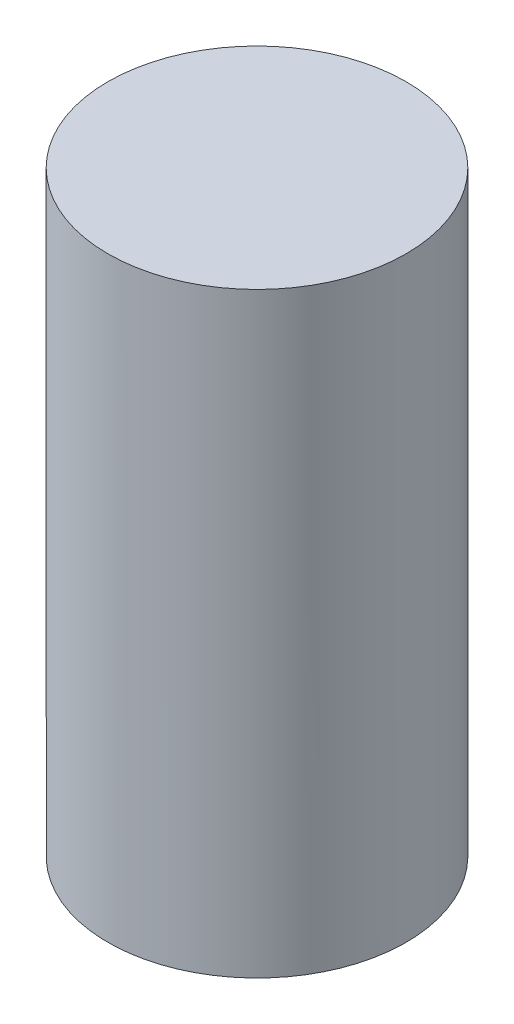
ISO-10303-21;
HEADER;
FILE_DESCRIPTION(('STEP AP214'),'2;1');
FILE_NAME('part.step','',(''),(''),'','','');
FILE_SCHEMA(('AUTOMOTIVE_DESIGN { 1 0 10303 214 1 1 1 1 }'));
ENDSEC;
DATA;
#1=APPLICATION_CONTEXT('core data for automotive mechanical design processes');
#2=APPLICATION_PROTOCOL_DEFINITION('international standard','automotive_design',2000,#1);
#3=PRODUCT_CONTEXT('',#1,'mechanical');
#4=PRODUCT('Part','Part','',(#3));
#5=PRODUCT_RELATED_PRODUCT_CATEGORY('part','',(#4));
#6=PRODUCT_DEFINITION_FORMATION('','',#4);
#7=PRODUCT_DEFINITION_CONTEXT('part definition',#1,'design');
#8=PRODUCT_DEFINITION('design','',#6,#7);
#9=PRODUCT_DEFINITION_SHAPE('','',#8);
#10=(LENGTH_UNIT() NAMED_UNIT(*) SI_UNIT(.MILLI.,.METRE.));
#11=(NAMED_UNIT(*) PLANE_ANGLE_UNIT() SI_UNIT($,.RADIAN.));
#12=(NAMED_UNIT(*) SI_UNIT($,.STERADIAN.) SOLID_ANGLE_UNIT());
#13=UNCERTAINTY_MEASURE_WITH_UNIT(LENGTH_MEASURE(1.E-05),#10,'distance_accuracy_value','');
#14=(GEOMETRIC_REPRESENTATION_CONTEXT(3) GLOBAL_UNCERTAINTY_ASSIGNED_CONTEXT((#13)) GLOBAL_UNIT_ASSIGNED_CONTEXT((#10,
#11,#12)) REPRESENTATION_CONTEXT('',''));
#15=CARTESIAN_POINT('',(0.,0.,0.));
#16=DIRECTION('',(0.,0.,1.));
#17=DIRECTION('',(1.,0.,0.));
#18=AXIS2_PLACEMENT_3D('',#15,#16,#17);
#19=CARTESIAN_POINT('',(0.,15.,0.));
#20=DIRECTION('',(0.,-1.,0.));
#21=DIRECTION('',(0.,0.,-1.));
#22=AXIS2_PLACEMENT_3D('',#19,#20,#21);
#23=CYLINDRICAL_SURFACE('',#22,5.);
#24=CARTESIAN_POINT('',(0.,-2.,0.));
#25=DIRECTION('',(0.,-1.,0.));
#26=DIRECTION('',(0.,0.,-1.));
#27=AXIS2_PLACEMENT_3D('',#24,#25,#26);
#28=CIRCLE('',#27,5.);
#29=CARTESIAN_POINT('',(0.,-2.,-5.));
#30=VERTEX_POINT('',#29);
#31=EDGE_CURVE('E161',#30,#30,#28,.T.);
#32=ORIENTED_EDGE('',*,*,#31,.F.);
#33=EDGE_LOOP('',(#32));
#34=FACE_BOUND('',#33,.T.);
#35=CARTESIAN_POINT('',(0.,18.,0.));
#36=DIRECTION('',(0.,1.,0.));
#37=DIRECTION('',(0.,0.,1.));
#38=AXIS2_PLACEMENT_3D('',#35,#36,#37);
#39=CIRCLE('',#38,5.);
#40=CARTESIAN_POINT('',(0.,18.,5.));
#41=VERTEX_POINT('',#40);
#42=EDGE_CURVE('E264',#41,#41,#39,.T.);
#43=ORIENTED_EDGE('',*,*,#42,.F.);
#44=EDGE_LOOP('',(#43));
#45=FACE_BOUND('',#44,.T.);
#46=ADVANCED_FACE('F42',(#34,#45),#23,.T.);
#47=CARTESIAN_POINT('',(1.29903810567666,15.,-0.750000000000004));
#48=DIRECTION('',(1.,0.,0.));
#49=DIRECTION('',(0.,0.,-1.));
#50=AXIS2_PLACEMENT_3D('',#47,#48,#49);
#51=PLANE('',#50);
#52=DIRECTION('',(0.,0.,1.));
#53=VECTOR('',#52,1.);
#54=CARTESIAN_POINT('',(1.29903810567666,0.,-0.750000000000004));
#55=LINE('',#54,#53);
#56=CARTESIAN_POINT('',(1.29903810567664,0.,-3.25000000000001));
#57=VERTEX_POINT('',#56);
#58=CARTESIAN_POINT('',(1.29903810567666,0.,-0.750000000000004));
#59=VERTEX_POINT('',#58);
#60=EDGE_CURVE('E184',#57,#59,#55,.T.);
#61=ORIENTED_EDGE('',*,*,#60,.F.);
#62=DIRECTION('',(0.,-1.,0.));
#63=VECTOR('',#62,1.);
#64=CARTESIAN_POINT('',(1.29903810567664,15.,-3.25000000000001));
#65=LINE('',#64,#63);
#66=CARTESIAN_POINT('',(1.29903810567664,15.,-3.25000000000001));
#67=VERTEX_POINT('',#66);
#68=EDGE_CURVE('E121',#67,#57,#65,.T.);
#69=ORIENTED_EDGE('',*,*,#68,.F.);
#70=DIRECTION('',(0.,0.,1.));
#71=VECTOR('',#70,1.);
#72=CARTESIAN_POINT('',(1.29903810567666,15.,-0.750000000000004));
#73=LINE('',#72,#71);
#74=CARTESIAN_POINT('',(1.29903810567666,15.,-0.750000000000004));
#75=VERTEX_POINT('',#74);
#76=EDGE_CURVE('E57',#67,#75,#73,.T.);
#77=ORIENTED_EDGE('',*,*,#76,.T.);
#78=DIRECTION('',(0.,-1.,0.));
#79=VECTOR('',#78,1.);
#80=CARTESIAN_POINT('',(1.29903810567666,15.,-0.750000000000004));
#81=LINE('',#80,#79);
#82=EDGE_CURVE('E11',#75,#59,#81,.T.);
#83=ORIENTED_EDGE('',*,*,#82,.T.);
#84=EDGE_LOOP('',(#61,#69,#77,#83));
#85=FACE_BOUND('',#84,.T.);
#86=ADVANCED_FACE('F203',(#85),#51,.T.);
#87=CARTESIAN_POINT('',(1.29903810567666,15.,-0.750000000000004));
#88=DIRECTION('',(0.5,0.,-0.866025403784439));
#89=DIRECTION('',(-0.866025403784439,0.,-0.5));
#90=AXIS2_PLACEMENT_3D('',#87,#88,#89);
#91=PLANE('',#90);
#92=DIRECTION('',(0.866025403784439,0.,0.5));
#93=VECTOR('',#92,1.);
#94=CARTESIAN_POINT('',(1.29903810567666,0.,-0.750000000000004));
#95=LINE('',#94,#93);
#96=CARTESIAN_POINT('',(3.46410161513776,0.,0.499999999999997));
#97=VERTEX_POINT('',#96);
#98=EDGE_CURVE('E69',#59,#97,#95,.T.);
#99=ORIENTED_EDGE('',*,*,#98,.F.);
#100=ORIENTED_EDGE('',*,*,#82,.F.);
#101=DIRECTION('',(0.866025403784439,0.,0.5));
#102=VECTOR('',#101,1.);
#103=CARTESIAN_POINT('',(1.29903810567666,15.,-0.750000000000004));
#104=LINE('',#103,#102);
#105=CARTESIAN_POINT('',(3.46410161513776,15.,0.499999999999997));
#106=VERTEX_POINT('',#105);
#107=EDGE_CURVE('E186',#75,#106,#104,.T.);
#108=ORIENTED_EDGE('',*,*,#107,.T.);
#109=DIRECTION('',(0.,-1.,0.));
#110=VECTOR('',#109,1.);
#111=CARTESIAN_POINT('',(3.46410161513776,15.,0.499999999999997));
#112=LINE('',#111,#110);
#113=EDGE_CURVE('E50',#106,#97,#112,.T.);
#114=ORIENTED_EDGE('',*,*,#113,.T.);
#115=EDGE_LOOP('',(#99,#100,#108,#114));
#116=FACE_BOUND('',#115,.T.);
#117=ADVANCED_FACE('F198',(#116),#91,.T.);
#118=CARTESIAN_POINT('',(0.,15.,0.));
#119=DIRECTION('',(0.,-1.,0.));
#120=DIRECTION('',(0.,0.,-1.));
#121=AXIS2_PLACEMENT_3D('',#118,#119,#120);
#122=CYLINDRICAL_SURFACE('',#121,3.5);
#123=CARTESIAN_POINT('',(0.,0.,0.));
#124=DIRECTION('',(0.,1.,0.));
#125=DIRECTION('',(0.,0.,1.));
#126=AXIS2_PLACEMENT_3D('',#123,#124,#125);
#127=CIRCLE('',#126,3.5);
#128=EDGE_CURVE('E187',#97,#57,#127,.T.);
#129=ORIENTED_EDGE('',*,*,#128,.F.);
#130=ORIENTED_EDGE('',*,*,#113,.F.);
#131=CARTESIAN_POINT('',(0.,15.,0.));
#132=DIRECTION('',(0.,1.,0.));
#133=DIRECTION('',(0.,0.,1.));
#134=AXIS2_PLACEMENT_3D('',#131,#132,#133);
#135=CIRCLE('',#134,3.5);
#136=EDGE_CURVE('E190',#106,#67,#135,.T.);
#137=ORIENTED_EDGE('',*,*,#136,.T.);
#138=ORIENTED_EDGE('',*,*,#68,.T.);
#139=EDGE_LOOP('',(#129,#130,#137,#138));
#140=FACE_BOUND('',#139,.T.);
#141=ADVANCED_FACE('F199',(#140),#122,.F.);
#142=CARTESIAN_POINT('',(-1.29903810567666,15.,-0.749999999999997));
#143=DIRECTION('',(-0.500000000000005,0.,-0.866025403784436));
#144=DIRECTION('',(-0.866025403784436,0.,0.500000000000005));
#145=AXIS2_PLACEMENT_3D('',#142,#143,#144);
#146=PLANE('',#145);
#147=DIRECTION('',(0.866025403784436,0.,-0.500000000000005));
#148=VECTOR('',#147,1.);
#149=CARTESIAN_POINT('',(-1.29903810567666,0.,-0.749999999999997));
#150=LINE('',#149,#148);
#151=CARTESIAN_POINT('',(-3.46410161513775,0.,0.500000000000017));
#152=VERTEX_POINT('',#151);
#153=CARTESIAN_POINT('',(-1.29903810567666,0.,-0.749999999999997));
#154=VERTEX_POINT('',#153);
#155=EDGE_CURVE('E166',#152,#154,#150,.T.);
#156=ORIENTED_EDGE('',*,*,#155,.F.);
#157=DIRECTION('',(0.,-1.,0.));
#158=VECTOR('',#157,1.);
#159=CARTESIAN_POINT('',(-3.46410161513775,15.,0.500000000000017));
#160=LINE('',#159,#158);
#161=CARTESIAN_POINT('',(-3.46410161513775,15.,0.500000000000017));
#162=VERTEX_POINT('',#161);
#163=EDGE_CURVE('E114',#162,#152,#160,.T.);
#164=ORIENTED_EDGE('',*,*,#163,.F.);
#165=DIRECTION('',(0.866025403784436,0.,-0.500000000000005));
#166=VECTOR('',#165,1.);
#167=CARTESIAN_POINT('',(-1.29903810567666,15.,-0.749999999999997));
#168=LINE('',#167,#166);
#169=CARTESIAN_POINT('',(-1.29903810567666,15.,-0.749999999999997));
#170=VERTEX_POINT('',#169);
#171=EDGE_CURVE('E76',#162,#170,#168,.T.);
#172=ORIENTED_EDGE('',*,*,#171,.T.);
#173=DIRECTION('',(0.,-1.,0.));
#174=VECTOR('',#173,1.);
#175=CARTESIAN_POINT('',(-1.29903810567666,15.,-0.749999999999997));
#176=LINE('',#175,#174);
#177=EDGE_CURVE('E182',#170,#154,#176,.T.);
#178=ORIENTED_EDGE('',*,*,#177,.T.);
#179=EDGE_LOOP('',(#156,#164,#172,#178));
#180=FACE_BOUND('',#179,.T.);
#181=ADVANCED_FACE('F214',(#180),#146,.T.);
#182=CARTESIAN_POINT('',(-1.29903810567666,15.,-0.749999999999997));
#183=DIRECTION('',(-1.,0.,0.));
#184=DIRECTION('',(0.,0.,1.));
#185=AXIS2_PLACEMENT_3D('',#182,#183,#184);
#186=PLANE('',#185);
#187=DIRECTION('',(0.,0.,-1.));
#188=VECTOR('',#187,1.);
#189=CARTESIAN_POINT('',(-1.29903810567666,0.,-0.749999999999997));
#190=LINE('',#189,#188);
#191=CARTESIAN_POINT('',(-1.29903810567666,0.,-3.25));
#192=VERTEX_POINT('',#191);
#193=EDGE_CURVE('E88',#154,#192,#190,.T.);
#194=ORIENTED_EDGE('',*,*,#193,.F.);
#195=ORIENTED_EDGE('',*,*,#177,.F.);
#196=DIRECTION('',(0.,0.,-1.));
#197=VECTOR('',#196,1.);
#198=CARTESIAN_POINT('',(-1.29903810567666,15.,-0.749999999999997));
#199=LINE('',#198,#197);
#200=CARTESIAN_POINT('',(-1.29903810567666,15.,-3.25));
#201=VERTEX_POINT('',#200);
#202=EDGE_CURVE('E168',#170,#201,#199,.T.);
#203=ORIENTED_EDGE('',*,*,#202,.T.);
#204=DIRECTION('',(0.,-1.,0.));
#205=VECTOR('',#204,1.);
#206=CARTESIAN_POINT('',(-1.29903810567666,15.,-3.25));
#207=LINE('',#206,#205);
#208=EDGE_CURVE('E180',#201,#192,#207,.T.);
#209=ORIENTED_EDGE('',*,*,#208,.T.);
#210=EDGE_LOOP('',(#194,#195,#203,#209));
#211=FACE_BOUND('',#210,.T.);
#212=ADVANCED_FACE('F217',(#211),#186,.T.);
#213=CARTESIAN_POINT('',(0.,15.,0.));
#214=DIRECTION('',(0.,-1.,0.));
#215=DIRECTION('',(0.,0.,-1.));
#216=AXIS2_PLACEMENT_3D('',#213,#214,#215);
#217=CYLINDRICAL_SURFACE('',#216,3.5);
#218=CARTESIAN_POINT('',(0.,0.,0.));
#219=DIRECTION('',(0.,1.,0.));
#220=DIRECTION('',(0.,0.,1.));
#221=AXIS2_PLACEMENT_3D('',#218,#219,#220);
#222=CIRCLE('',#221,3.5);
#223=EDGE_CURVE('E169',#192,#152,#222,.T.);
#224=ORIENTED_EDGE('',*,*,#223,.F.);
#225=ORIENTED_EDGE('',*,*,#208,.F.);
#226=CARTESIAN_POINT('',(0.,15.,0.));
#227=DIRECTION('',(0.,1.,0.));
#228=DIRECTION('',(0.,0.,1.));
#229=AXIS2_PLACEMENT_3D('',#226,#227,#228);
#230=CIRCLE('',#229,3.5);
#231=EDGE_CURVE('E172',#201,#162,#230,.T.);
#232=ORIENTED_EDGE('',*,*,#231,.T.);
#233=ORIENTED_EDGE('',*,*,#163,.T.);
#234=EDGE_LOOP('',(#224,#225,#232,#233));
#235=FACE_BOUND('',#234,.T.);
#236=ADVANCED_FACE('F221',(#235),#217,.F.);
#237=CARTESIAN_POINT('',(0.,15.,1.5));
#238=DIRECTION('',(-0.499999999999995,0.,0.866025403784441));
#239=DIRECTION('',(0.866025403784441,0.,0.499999999999995));
#240=AXIS2_PLACEMENT_3D('',#237,#238,#239);
#241=PLANE('',#240);
#242=DIRECTION('',(-0.866025403784441,0.,-0.499999999999995));
#243=VECTOR('',#242,1.);
#244=CARTESIAN_POINT('',(0.,0.,1.5));
#245=LINE('',#244,#243);
#246=CARTESIAN_POINT('',(2.16506350946111,0.,2.74999999999999));
#247=VERTEX_POINT('',#246);
#248=CARTESIAN_POINT('',(0.,0.,1.5));
#249=VERTEX_POINT('',#248);
#250=EDGE_CURVE('E158',#247,#249,#245,.T.);
#251=ORIENTED_EDGE('',*,*,#250,.F.);
#252=DIRECTION('',(0.,-1.,0.));
#253=VECTOR('',#252,1.);
#254=CARTESIAN_POINT('',(2.16506350946111,15.,2.74999999999999));
#255=LINE('',#254,#253);
#256=CARTESIAN_POINT('',(2.16506350946111,15.,2.74999999999999));
#257=VERTEX_POINT('',#256);
#258=EDGE_CURVE('E144',#257,#247,#255,.T.);
#259=ORIENTED_EDGE('',*,*,#258,.F.);
#260=DIRECTION('',(-0.866025403784441,0.,-0.499999999999995));
#261=VECTOR('',#260,1.);
#262=CARTESIAN_POINT('',(0.,15.,1.5));
#263=LINE('',#262,#261);
#264=CARTESIAN_POINT('',(0.,15.,1.5));
#265=VERTEX_POINT('',#264);
#266=EDGE_CURVE('E96',#257,#265,#263,.T.);
#267=ORIENTED_EDGE('',*,*,#266,.T.);
#268=DIRECTION('',(0.,-1.,0.));
#269=VECTOR('',#268,1.);
#270=CARTESIAN_POINT('',(0.,15.,1.5));
#271=LINE('',#270,#269);
#272=EDGE_CURVE('E151',#265,#249,#271,.T.);
#273=ORIENTED_EDGE('',*,*,#272,.T.);
#274=EDGE_LOOP('',(#251,#259,#267,#273));
#275=FACE_BOUND('',#274,.T.);
#276=ADVANCED_FACE('F224',(#275),#241,.T.);
#277=CARTESIAN_POINT('',(0.,15.,1.5));
#278=DIRECTION('',(0.500000000000001,0.,0.866025403784438));
#279=DIRECTION('',(0.866025403784438,0.,-0.500000000000001));
#280=AXIS2_PLACEMENT_3D('',#277,#278,#279);
#281=PLANE('',#280);
#282=DIRECTION('',(-0.866025403784438,0.,0.500000000000001));
#283=VECTOR('',#282,1.);
#284=CARTESIAN_POINT('',(0.,0.,1.5));
#285=LINE('',#284,#283);
#286=CARTESIAN_POINT('',(-2.16506350946109,0.,2.75));
#287=VERTEX_POINT('',#286);
#288=EDGE_CURVE('E107',#249,#287,#285,.T.);
#289=ORIENTED_EDGE('',*,*,#288,.F.);
#290=ORIENTED_EDGE('',*,*,#272,.F.);
#291=DIRECTION('',(-0.866025403784438,0.,0.500000000000001));
#292=VECTOR('',#291,1.);
#293=CARTESIAN_POINT('',(0.,15.,1.5));
#294=LINE('',#293,#292);
#295=CARTESIAN_POINT('',(-2.16506350946109,15.,2.75));
#296=VERTEX_POINT('',#295);
#297=EDGE_CURVE('E141',#265,#296,#294,.T.);
#298=ORIENTED_EDGE('',*,*,#297,.T.);
#299=DIRECTION('',(0.,-1.,0.));
#300=VECTOR('',#299,1.);
#301=CARTESIAN_POINT('',(-2.16506350946109,15.,2.75));
#302=LINE('',#301,#300);
#303=EDGE_CURVE('E147',#296,#287,#302,.T.);
#304=ORIENTED_EDGE('',*,*,#303,.T.);
#305=EDGE_LOOP('',(#289,#290,#298,#304));
#306=FACE_BOUND('',#305,.T.);
#307=ADVANCED_FACE('F153',(#306),#281,.T.);
#308=CARTESIAN_POINT('',(0.,15.,0.));
#309=DIRECTION('',(0.,-1.,0.));
#310=DIRECTION('',(0.,0.,-1.));
#311=AXIS2_PLACEMENT_3D('',#308,#309,#310);
#312=CYLINDRICAL_SURFACE('',#311,3.5);
#313=CARTESIAN_POINT('',(0.,0.,0.));
#314=DIRECTION('',(0.,1.,0.));
#315=DIRECTION('',(0.,0.,1.));
#316=AXIS2_PLACEMENT_3D('',#313,#314,#315);
#317=CIRCLE('',#316,3.5);
#318=EDGE_CURVE('E150',#287,#247,#317,.T.);
#319=ORIENTED_EDGE('',*,*,#318,.F.);
#320=ORIENTED_EDGE('',*,*,#303,.F.);
#321=CARTESIAN_POINT('',(0.,15.,0.));
#322=DIRECTION('',(0.,1.,0.));
#323=DIRECTION('',(0.,0.,1.));
#324=AXIS2_PLACEMENT_3D('',#321,#322,#323);
#325=CIRCLE('',#324,3.5);
#326=EDGE_CURVE('E137',#296,#257,#325,.T.);
#327=ORIENTED_EDGE('',*,*,#326,.T.);
#328=ORIENTED_EDGE('',*,*,#258,.T.);
#329=EDGE_LOOP('',(#319,#320,#327,#328));
#330=FACE_BOUND('',#329,.T.);
#331=ADVANCED_FACE('F148',(#330),#312,.F.);
#332=CARTESIAN_POINT('',(0.,0.,0.));
#333=DIRECTION('',(0.,-1.,0.));
#334=DIRECTION('',(0.,0.,-1.));
#335=AXIS2_PLACEMENT_3D('',#332,#333,#334);
#336=PLANE('',#335);
#337=CARTESIAN_POINT('',(-2.16506350946109,0.,-1.25));
#338=DIRECTION('',(0.,-1.,0.));
#339=DIRECTION('',(0.,0.,-1.));
#340=AXIS2_PLACEMENT_3D('',#337,#338,#339);
#341=CIRCLE('',#340,0.75);
#342=CARTESIAN_POINT('',(-2.16506350946109,0.,-2.));
#343=VERTEX_POINT('',#342);
#344=EDGE_CURVE('E266',#343,#343,#341,.T.);
#345=ORIENTED_EDGE('',*,*,#344,.T.);
#346=EDGE_LOOP('',(#345));
#347=FACE_BOUND('',#346,.T.);
#348=ORIENTED_EDGE('',*,*,#223,.T.);
#349=ORIENTED_EDGE('',*,*,#155,.T.);
#350=ORIENTED_EDGE('',*,*,#193,.T.);
#351=EDGE_LOOP('',(#348,#349,#350));
#352=FACE_BOUND('',#351,.T.);
#353=ADVANCED_FACE('F232',(#347,#352),#336,.F.);
#354=CARTESIAN_POINT('',(2.1650635094611,0.,-1.25));
#355=DIRECTION('',(0.,-1.,0.));
#356=DIRECTION('',(0.,0.,-1.));
#357=AXIS2_PLACEMENT_3D('',#354,#355,#356);
#358=CIRCLE('',#357,0.75);
#359=CARTESIAN_POINT('',(2.1650635094611,0.,-2.));
#360=VERTEX_POINT('',#359);
#361=EDGE_CURVE('E273',#360,#360,#358,.T.);
#362=ORIENTED_EDGE('',*,*,#361,.T.);
#363=EDGE_LOOP('',(#362));
#364=FACE_BOUND('',#363,.T.);
#365=ORIENTED_EDGE('',*,*,#128,.T.);
#366=ORIENTED_EDGE('',*,*,#60,.T.);
#367=ORIENTED_EDGE('',*,*,#98,.T.);
#368=EDGE_LOOP('',(#365,#366,#367));
#369=FACE_BOUND('',#368,.T.);
#370=ADVANCED_FACE('F201',(#364,#369),#336,.F.);
#371=CARTESIAN_POINT('',(0.,0.,2.5));
#372=DIRECTION('',(0.,-1.,0.));
#373=DIRECTION('',(0.,0.,-1.));
#374=AXIS2_PLACEMENT_3D('',#371,#372,#373);
#375=CIRCLE('',#374,0.750000000000004);
#376=CARTESIAN_POINT('',(0.,0.,1.75));
#377=VERTEX_POINT('',#376);
#378=EDGE_CURVE('E278',#377,#377,#375,.T.);
#379=ORIENTED_EDGE('',*,*,#378,.T.);
#380=EDGE_LOOP('',(#379));
#381=FACE_BOUND('',#380,.T.);
#382=ORIENTED_EDGE('',*,*,#318,.T.);
#383=ORIENTED_EDGE('',*,*,#250,.T.);
#384=ORIENTED_EDGE('',*,*,#288,.T.);
#385=EDGE_LOOP('',(#382,#383,#384));
#386=FACE_BOUND('',#385,.T.);
#387=ADVANCED_FACE('F236',(#381,#386),#336,.F.);
#388=CARTESIAN_POINT('',(0.,-2.,0.));
#389=DIRECTION('',(0.,-1.,0.));
#390=DIRECTION('',(0.,0.,-1.));
#391=AXIS2_PLACEMENT_3D('',#388,#389,#390);
#392=PLANE('',#391);
#393=CARTESIAN_POINT('',(2.1650635094611,-2.,-1.25));
#394=DIRECTION('',(0.,-1.,0.));
#395=DIRECTION('',(0.,0.,-1.));
#396=AXIS2_PLACEMENT_3D('',#393,#394,#395);
#397=CIRCLE('',#396,0.75);
#398=CARTESIAN_POINT('',(2.1650635094611,-2.,-2.));
#399=VERTEX_POINT('',#398);
#400=EDGE_CURVE('E275',#399,#399,#397,.T.);
#401=ORIENTED_EDGE('',*,*,#400,.F.);
#402=EDGE_LOOP('',(#401));
#403=FACE_BOUND('',#402,.T.);
#404=ORIENTED_EDGE('',*,*,#31,.T.);
#405=EDGE_LOOP('',(#404));
#406=FACE_BOUND('',#405,.T.);
#407=CARTESIAN_POINT('',(0.,-2.,2.5));
#408=DIRECTION('',(0.,-1.,0.));
#409=DIRECTION('',(0.,0.,-1.));
#410=AXIS2_PLACEMENT_3D('',#407,#408,#409);
#411=CIRCLE('',#410,0.750000000000004);
#412=CARTESIAN_POINT('',(0.,-2.,1.75));
#413=VERTEX_POINT('',#412);
#414=EDGE_CURVE('E281',#413,#413,#411,.T.);
#415=ORIENTED_EDGE('',*,*,#414,.F.);
#416=EDGE_LOOP('',(#415));
#417=FACE_BOUND('',#416,.T.);
#418=CARTESIAN_POINT('',(-2.16506350946109,-2.,-1.25));
#419=DIRECTION('',(0.,-1.,0.));
#420=DIRECTION('',(0.,0.,-1.));
#421=AXIS2_PLACEMENT_3D('',#418,#419,#420);
#422=CIRCLE('',#421,0.75);
#423=CARTESIAN_POINT('',(-2.16506350946109,-2.,-2.));
#424=VERTEX_POINT('',#423);
#425=EDGE_CURVE('E269',#424,#424,#422,.T.);
#426=ORIENTED_EDGE('',*,*,#425,.F.);
#427=EDGE_LOOP('',(#426));
#428=FACE_BOUND('',#427,.T.);
#429=ADVANCED_FACE('F237',(#403,#406,#417,#428),#392,.T.);
#430=CARTESIAN_POINT('',(0.,-2.,2.5));
#431=DIRECTION('',(0.,1.,0.));
#432=DIRECTION('',(0.,0.,1.));
#433=AXIS2_PLACEMENT_3D('',#430,#431,#432);
#434=CYLINDRICAL_SURFACE('',#433,0.750000000000004);
#435=ORIENTED_EDGE('',*,*,#414,.T.);
#436=EDGE_LOOP('',(#435));
#437=FACE_BOUND('',#436,.T.);
#438=ORIENTED_EDGE('',*,*,#378,.F.);
#439=EDGE_LOOP('',(#438));
#440=FACE_BOUND('',#439,.T.);
#441=ADVANCED_FACE('F240',(#437,#440),#434,.F.);
#442=CARTESIAN_POINT('',(2.1650635094611,-2.,-1.25));
#443=DIRECTION('',(0.,1.,0.));
#444=DIRECTION('',(0.,0.,1.));
#445=AXIS2_PLACEMENT_3D('',#442,#443,#444);
#446=CYLINDRICAL_SURFACE('',#445,0.75);
#447=ORIENTED_EDGE('',*,*,#400,.T.);
#448=EDGE_LOOP('',(#447));
#449=FACE_BOUND('',#448,.T.);
#450=ORIENTED_EDGE('',*,*,#361,.F.);
#451=EDGE_LOOP('',(#450));
#452=FACE_BOUND('',#451,.T.);
#453=ADVANCED_FACE('F244',(#449,#452),#446,.F.);
#454=CARTESIAN_POINT('',(-2.16506350946109,-2.,-1.25));
#455=DIRECTION('',(0.,1.,0.));
#456=DIRECTION('',(0.,0.,1.));
#457=AXIS2_PLACEMENT_3D('',#454,#455,#456);
#458=CYLINDRICAL_SURFACE('',#457,0.75);
#459=ORIENTED_EDGE('',*,*,#425,.T.);
#460=EDGE_LOOP('',(#459));
#461=FACE_BOUND('',#460,.T.);
#462=ORIENTED_EDGE('',*,*,#344,.F.);
#463=EDGE_LOOP('',(#462));
#464=FACE_BOUND('',#463,.T.);
#465=ADVANCED_FACE('F248',(#461,#464),#458,.F.);
#466=CARTESIAN_POINT('',(0.,15.,0.));
#467=DIRECTION('',(0.,1.,0.));
#468=DIRECTION('',(0.,0.,1.));
#469=AXIS2_PLACEMENT_3D('',#466,#467,#468);
#470=PLANE('',#469);
#471=ORIENTED_EDGE('',*,*,#297,.F.);
#472=ORIENTED_EDGE('',*,*,#266,.F.);
#473=ORIENTED_EDGE('',*,*,#326,.F.);
#474=EDGE_LOOP('',(#471,#472,#473));
#475=FACE_BOUND('',#474,.T.);
#476=ADVANCED_FACE('F139',(#475),#470,.F.);
#477=ORIENTED_EDGE('',*,*,#202,.F.);
#478=ORIENTED_EDGE('',*,*,#171,.F.);
#479=ORIENTED_EDGE('',*,*,#231,.F.);
#480=EDGE_LOOP('',(#477,#478,#479));
#481=FACE_BOUND('',#480,.T.);
#482=ADVANCED_FACE('F257',(#481),#470,.F.);
#483=ORIENTED_EDGE('',*,*,#107,.F.);
#484=ORIENTED_EDGE('',*,*,#76,.F.);
#485=ORIENTED_EDGE('',*,*,#136,.F.);
#486=EDGE_LOOP('',(#483,#484,#485));
#487=FACE_BOUND('',#486,.T.);
#488=ADVANCED_FACE('F253',(#487),#470,.F.);
#489=CARTESIAN_POINT('',(0.,18.,0.));
#490=DIRECTION('',(0.,1.,0.));
#491=DIRECTION('',(0.,0.,1.));
#492=AXIS2_PLACEMENT_3D('',#489,#490,#491);
#493=PLANE('',#492);
#494=ORIENTED_EDGE('',*,*,#42,.T.);
#495=EDGE_LOOP('',(#494));
#496=FACE_BOUND('',#495,.T.);
#497=ADVANCED_FACE('F256',(#496),#493,.T.);
#498=CLOSED_SHELL('',(#46,#86,#117,#141,#181,#212,#236,#276,#307,#331,#353,#370,#387,#429,#441,
#453,#465,#476,#482,#488,#497));
#499=MANIFOLD_SOLID_BREP('B2',#498);
#500=ADVANCED_BREP_SHAPE_REPRESENTATION('',(#18,#499),#14);
#501=SHAPE_DEFINITION_REPRESENTATION(#9,#500);
ENDSEC;
END-ISO-10303-21;
